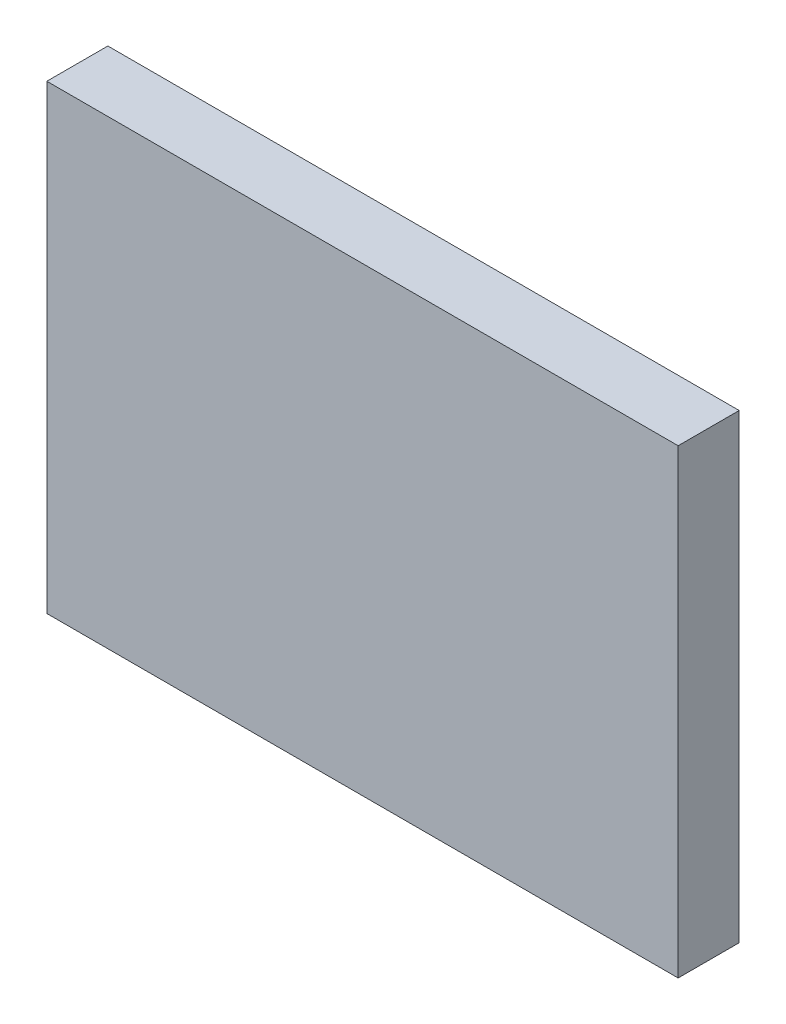
ISO-10303-21;
HEADER;
FILE_DESCRIPTION(('STEP AP214'),'2;1');
FILE_NAME('part.step','',(''),(''),'','','');
FILE_SCHEMA(('AUTOMOTIVE_DESIGN { 1 0 10303 214 1 1 1 1 }'));
ENDSEC;
DATA;
#1=APPLICATION_CONTEXT('core data for automotive mechanical design processes');
#2=APPLICATION_PROTOCOL_DEFINITION('international standard','automotive_design',2000,#1);
#3=PRODUCT_CONTEXT('',#1,'mechanical');
#4=PRODUCT('Part','Part','',(#3));
#5=PRODUCT_RELATED_PRODUCT_CATEGORY('part','',(#4));
#6=PRODUCT_DEFINITION_FORMATION('','',#4);
#7=PRODUCT_DEFINITION_CONTEXT('part definition',#1,'design');
#8=PRODUCT_DEFINITION('design','',#6,#7);
#9=PRODUCT_DEFINITION_SHAPE('','',#8);
#10=(LENGTH_UNIT() NAMED_UNIT(*) SI_UNIT(.MILLI.,.METRE.));
#11=(NAMED_UNIT(*) PLANE_ANGLE_UNIT() SI_UNIT($,.RADIAN.));
#12=(NAMED_UNIT(*) SI_UNIT($,.STERADIAN.) SOLID_ANGLE_UNIT());
#13=UNCERTAINTY_MEASURE_WITH_UNIT(LENGTH_MEASURE(1.E-05),#10,'distance_accuracy_value','');
#14=(GEOMETRIC_REPRESENTATION_CONTEXT(3) GLOBAL_UNCERTAINTY_ASSIGNED_CONTEXT((#13)) GLOBAL_UNIT_ASSIGNED_CONTEXT((#10,
#11,#12)) REPRESENTATION_CONTEXT('',''));
#15=CARTESIAN_POINT('',(0.,0.,0.));
#16=DIRECTION('',(0.,0.,1.));
#17=DIRECTION('',(1.,0.,0.));
#18=AXIS2_PLACEMENT_3D('',#15,#16,#17);
#19=CARTESIAN_POINT('',(-43.6019491407738,39.5883806006189,10.));
#20=DIRECTION('',(1.,0.,0.));
#21=DIRECTION('',(0.,0.,-1.));
#22=AXIS2_PLACEMENT_3D('',#19,#20,#21);
#23=PLANE('',#22);
#24=DIRECTION('',(0.,-1.,0.));
#25=VECTOR('',#24,1.);
#26=CARTESIAN_POINT('',(-43.6019491407738,39.5883806006189,0.));
#27=LINE('',#26,#25);
#28=CARTESIAN_POINT('',(-43.6019491407738,39.5883806006189,0.));
#29=VERTEX_POINT('',#28);
#30=CARTESIAN_POINT('',(-43.6019491407738,-35.9396819277508,0.));
#31=VERTEX_POINT('',#30);
#32=EDGE_CURVE('E107',#29,#31,#27,.T.);
#33=ORIENTED_EDGE('',*,*,#32,.T.);
#34=DIRECTION('',(0.,0.,-1.));
#35=VECTOR('',#34,1.);
#36=CARTESIAN_POINT('',(-43.6019491407738,-35.9396819277508,10.));
#37=LINE('',#36,#35);
#38=CARTESIAN_POINT('',(-43.6019491407738,-35.9396819277508,10.));
#39=VERTEX_POINT('',#38);
#40=EDGE_CURVE('E11',#39,#31,#37,.T.);
#41=ORIENTED_EDGE('',*,*,#40,.F.);
#42=DIRECTION('',(0.,-1.,0.));
#43=VECTOR('',#42,1.);
#44=CARTESIAN_POINT('',(-43.6019491407738,39.5883806006189,10.));
#45=LINE('',#44,#43);
#46=CARTESIAN_POINT('',(-43.6019491407738,39.5883806006189,10.));
#47=VERTEX_POINT('',#46);
#48=EDGE_CURVE('E91',#47,#39,#45,.T.);
#49=ORIENTED_EDGE('',*,*,#48,.F.);
#50=DIRECTION('',(0.,0.,-1.));
#51=VECTOR('',#50,1.);
#52=CARTESIAN_POINT('',(-43.6019491407738,39.5883806006189,10.));
#53=LINE('',#52,#51);
#54=EDGE_CURVE('E103',#47,#29,#53,.T.);
#55=ORIENTED_EDGE('',*,*,#54,.T.);
#56=EDGE_LOOP('',(#33,#41,#49,#55));
#57=FACE_BOUND('',#56,.T.);
#58=ADVANCED_FACE('F39',(#57),#23,.F.);
#59=CARTESIAN_POINT('',(-43.6019491407738,-35.9396819277508,10.));
#60=DIRECTION('',(0.,1.,0.));
#61=DIRECTION('',(0.,0.,1.));
#62=AXIS2_PLACEMENT_3D('',#59,#60,#61);
#63=PLANE('',#62);
#64=DIRECTION('',(1.,0.,0.));
#65=VECTOR('',#64,1.);
#66=CARTESIAN_POINT('',(-43.6019491407738,-35.9396819277508,0.));
#67=LINE('',#66,#65);
#68=CARTESIAN_POINT('',(59.8386582350369,-35.9396819277508,0.));
#69=VERTEX_POINT('',#68);
#70=EDGE_CURVE('E96',#31,#69,#67,.T.);
#71=ORIENTED_EDGE('',*,*,#70,.T.);
#72=DIRECTION('',(0.,0.,-1.));
#73=VECTOR('',#72,1.);
#74=CARTESIAN_POINT('',(59.8386582350369,-35.9396819277508,10.));
#75=LINE('',#74,#73);
#76=CARTESIAN_POINT('',(59.8386582350369,-35.9396819277508,10.));
#77=VERTEX_POINT('',#76);
#78=EDGE_CURVE('E48',#77,#69,#75,.T.);
#79=ORIENTED_EDGE('',*,*,#78,.F.);
#80=DIRECTION('',(1.,0.,0.));
#81=VECTOR('',#80,1.);
#82=CARTESIAN_POINT('',(-43.6019491407738,-35.9396819277508,10.));
#83=LINE('',#82,#81);
#84=EDGE_CURVE('E86',#39,#77,#83,.T.);
#85=ORIENTED_EDGE('',*,*,#84,.F.);
#86=ORIENTED_EDGE('',*,*,#40,.T.);
#87=EDGE_LOOP('',(#71,#79,#85,#86));
#88=FACE_BOUND('',#87,.T.);
#89=ADVANCED_FACE('F95',(#88),#63,.F.);
#90=CARTESIAN_POINT('',(59.8386582350369,39.5883806006189,10.));
#91=DIRECTION('',(-1.,0.,0.));
#92=DIRECTION('',(0.,0.,1.));
#93=AXIS2_PLACEMENT_3D('',#90,#91,#92);
#94=PLANE('',#93);
#95=DIRECTION('',(0.,1.,0.));
#96=VECTOR('',#95,1.);
#97=CARTESIAN_POINT('',(59.8386582350369,39.5883806006189,0.));
#98=LINE('',#97,#96);
#99=CARTESIAN_POINT('',(59.8386582350369,39.5883806006189,0.));
#100=VERTEX_POINT('',#99);
#101=EDGE_CURVE('E73',#69,#100,#98,.T.);
#102=ORIENTED_EDGE('',*,*,#101,.T.);
#103=DIRECTION('',(0.,0.,-1.));
#104=VECTOR('',#103,1.);
#105=CARTESIAN_POINT('',(59.8386582350369,39.5883806006189,10.));
#106=LINE('',#105,#104);
#107=CARTESIAN_POINT('',(59.8386582350369,39.5883806006189,10.));
#108=VERTEX_POINT('',#107);
#109=EDGE_CURVE('E98',#108,#100,#106,.T.);
#110=ORIENTED_EDGE('',*,*,#109,.F.);
#111=DIRECTION('',(0.,1.,0.));
#112=VECTOR('',#111,1.);
#113=CARTESIAN_POINT('',(59.8386582350369,39.5883806006189,10.));
#114=LINE('',#113,#112);
#115=EDGE_CURVE('E89',#77,#108,#114,.T.);
#116=ORIENTED_EDGE('',*,*,#115,.F.);
#117=ORIENTED_EDGE('',*,*,#78,.T.);
#118=EDGE_LOOP('',(#102,#110,#116,#117));
#119=FACE_BOUND('',#118,.T.);
#120=ADVANCED_FACE('F99',(#119),#94,.F.);
#121=CARTESIAN_POINT('',(-43.6019491407738,39.5883806006189,10.));
#122=DIRECTION('',(0.,-1.,0.));
#123=DIRECTION('',(0.,0.,-1.));
#124=AXIS2_PLACEMENT_3D('',#121,#122,#123);
#125=PLANE('',#124);
#126=DIRECTION('',(-1.,0.,0.));
#127=VECTOR('',#126,1.);
#128=CARTESIAN_POINT('',(-43.6019491407738,39.5883806006189,0.));
#129=LINE('',#128,#127);
#130=EDGE_CURVE('E79',#100,#29,#129,.T.);
#131=ORIENTED_EDGE('',*,*,#130,.T.);
#132=ORIENTED_EDGE('',*,*,#54,.F.);
#133=DIRECTION('',(-1.,0.,0.));
#134=VECTOR('',#133,1.);
#135=CARTESIAN_POINT('',(-43.6019491407738,39.5883806006189,10.));
#136=LINE('',#135,#134);
#137=EDGE_CURVE('E56',#108,#47,#136,.T.);
#138=ORIENTED_EDGE('',*,*,#137,.F.);
#139=ORIENTED_EDGE('',*,*,#109,.T.);
#140=EDGE_LOOP('',(#131,#132,#138,#139));
#141=FACE_BOUND('',#140,.T.);
#142=ADVANCED_FACE('F120',(#141),#125,.F.);
#143=CARTESIAN_POINT('',(0.,0.,10.));
#144=DIRECTION('',(0.,0.,1.));
#145=DIRECTION('',(1.,0.,0.));
#146=AXIS2_PLACEMENT_3D('',#143,#144,#145);
#147=PLANE('',#146);
#148=ORIENTED_EDGE('',*,*,#48,.T.);
#149=ORIENTED_EDGE('',*,*,#84,.T.);
#150=ORIENTED_EDGE('',*,*,#115,.T.);
#151=ORIENTED_EDGE('',*,*,#137,.T.);
#152=EDGE_LOOP('',(#148,#149,#150,#151));
#153=FACE_BOUND('',#152,.T.);
#154=ADVANCED_FACE('F87',(#153),#147,.T.);
#155=CARTESIAN_POINT('',(0.,0.,0.));
#156=DIRECTION('',(0.,0.,1.));
#157=DIRECTION('',(1.,0.,0.));
#158=AXIS2_PLACEMENT_3D('',#155,#156,#157);
#159=PLANE('',#158);
#160=ORIENTED_EDGE('',*,*,#32,.F.);
#161=ORIENTED_EDGE('',*,*,#130,.F.);
#162=ORIENTED_EDGE('',*,*,#101,.F.);
#163=ORIENTED_EDGE('',*,*,#70,.F.);
#164=EDGE_LOOP('',(#160,#161,#162,#163));
#165=FACE_BOUND('',#164,.T.);
#166=ADVANCED_FACE('F123',(#165),#159,.F.);
#167=CLOSED_SHELL('',(#58,#89,#120,#142,#154,#166));
#168=MANIFOLD_SOLID_BREP('B2',#167);
#169=ADVANCED_BREP_SHAPE_REPRESENTATION('',(#18,#168),#14);
#170=SHAPE_DEFINITION_REPRESENTATION(#9,#169);
ENDSEC;
END-ISO-10303-21;
